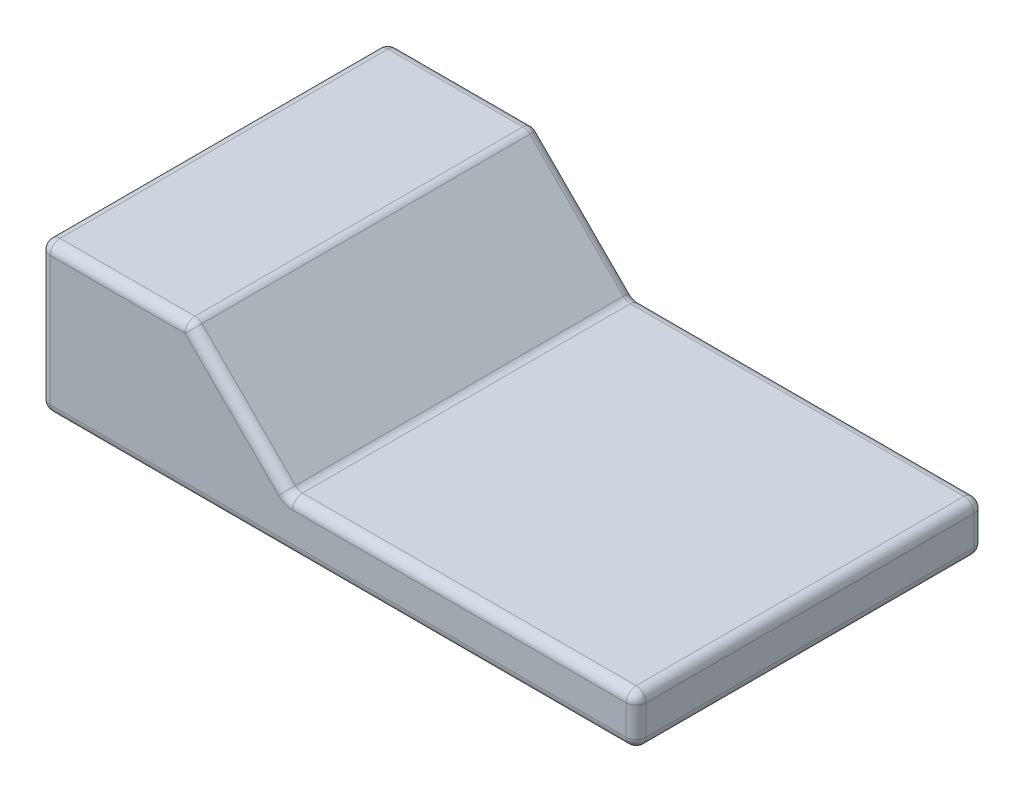
ISO-10303-21;
HEADER;
FILE_DESCRIPTION(('STEP AP214'),'2;1');
FILE_NAME('part.step','',(''),(''),'','','');
FILE_SCHEMA(('AUTOMOTIVE_DESIGN { 1 0 10303 214 1 1 1 1 }'));
ENDSEC;
DATA;
#1=APPLICATION_CONTEXT('core data for automotive mechanical design processes');
#2=APPLICATION_PROTOCOL_DEFINITION('international standard','automotive_design',2000,#1);
#3=PRODUCT_CONTEXT('',#1,'mechanical');
#4=PRODUCT('Part','Part','',(#3));
#5=PRODUCT_RELATED_PRODUCT_CATEGORY('part','',(#4));
#6=PRODUCT_DEFINITION_FORMATION('','',#4);
#7=PRODUCT_DEFINITION_CONTEXT('part definition',#1,'design');
#8=PRODUCT_DEFINITION('design','',#6,#7);
#9=PRODUCT_DEFINITION_SHAPE('','',#8);
#10=(LENGTH_UNIT() NAMED_UNIT(*) SI_UNIT(.MILLI.,.METRE.));
#11=(NAMED_UNIT(*) PLANE_ANGLE_UNIT() SI_UNIT($,.RADIAN.));
#12=(NAMED_UNIT(*) SI_UNIT($,.STERADIAN.) SOLID_ANGLE_UNIT());
#13=UNCERTAINTY_MEASURE_WITH_UNIT(LENGTH_MEASURE(1.E-05),#10,'distance_accuracy_value','');
#14=(GEOMETRIC_REPRESENTATION_CONTEXT(3) GLOBAL_UNCERTAINTY_ASSIGNED_CONTEXT((#13)) GLOBAL_UNIT_ASSIGNED_CONTEXT((#10,
#11,#12)) REPRESENTATION_CONTEXT('',''));
#15=CARTESIAN_POINT('',(0.,0.,0.));
#16=DIRECTION('',(0.,0.,1.));
#17=DIRECTION('',(1.,0.,0.));
#18=AXIS2_PLACEMENT_3D('',#15,#16,#17);
#19=CARTESIAN_POINT('',(48.7982787619449,82.5,6.));
#20=DIRECTION('',(-1.,0.,0.));
#21=DIRECTION('',(0.,0.,1.));
#22=AXIS2_PLACEMENT_3D('',#19,#20,#21);
#23=CONICAL_SURFACE('',#22,2.,1.02974425867666);
#24=CARTESIAN_POINT('',(50.,82.5,6.));
#25=VERTEX_POINT('',#24);
#26=VERTEX_LOOP('',#25);
#27=FACE_BOUND('',#26,.T.);
#28=CARTESIAN_POINT('',(48.7982787619449,82.5,6.));
#29=DIRECTION('',(-1.,0.,0.));
#30=DIRECTION('',(0.,0.,1.));
#31=AXIS2_PLACEMENT_3D('',#28,#29,#30);
#32=CIRCLE('',#31,2.);
#33=CARTESIAN_POINT('',(48.7982787619449,82.5,8.));
#34=VERTEX_POINT('',#33);
#35=EDGE_CURVE('E195',#34,#34,#32,.T.);
#36=ORIENTED_EDGE('',*,*,#35,.T.);
#37=EDGE_LOOP('',(#36));
#38=FACE_BOUND('',#37,.T.);
#39=ADVANCED_FACE('F47',(#27,#38),#23,.F.);
#40=CARTESIAN_POINT('',(32.,82.5,6.));
#41=DIRECTION('',(-1.,0.,0.));
#42=DIRECTION('',(0.,0.,1.));
#43=AXIS2_PLACEMENT_3D('',#40,#41,#42);
#44=CYLINDRICAL_SURFACE('',#43,2.);
#45=ORIENTED_EDGE('',*,*,#35,.F.);
#46=EDGE_LOOP('',(#45));
#47=FACE_BOUND('',#46,.T.);
#48=CARTESIAN_POINT('',(32.025,82.5,6.));
#49=DIRECTION('',(-1.,0.,0.));
#50=DIRECTION('',(0.,0.,1.));
#51=AXIS2_PLACEMENT_3D('',#48,#49,#50);
#52=CIRCLE('',#51,2.);
#53=CARTESIAN_POINT('',(32.025,82.5,8.));
#54=VERTEX_POINT('',#53);
#55=EDGE_CURVE('E191',#54,#54,#52,.T.);
#56=ORIENTED_EDGE('',*,*,#55,.T.);
#57=EDGE_LOOP('',(#56));
#58=FACE_BOUND('',#57,.T.);
#59=ADVANCED_FACE('F393',(#47,#58),#44,.F.);
#60=CARTESIAN_POINT('',(33.,82.5,6.));
#61=DIRECTION('',(-1.,0.,0.));
#62=DIRECTION('',(0.,0.,1.));
#63=AXIS2_PLACEMENT_3D('',#60,#61,#62);
#64=TOROIDAL_SURFACE('',#63,2.22220486043288,1.);
#65=CARTESIAN_POINT('',(32.,82.5,6.));
#66=DIRECTION('',(-1.,0.,0.));
#67=DIRECTION('',(0.,0.,1.));
#68=AXIS2_PLACEMENT_3D('',#65,#66,#67);
#69=CIRCLE('',#68,2.22220486043288);
#70=CARTESIAN_POINT('',(32.,82.5,8.22220486043287));
#71=VERTEX_POINT('',#70);
#72=EDGE_CURVE('E55',#71,#71,#69,.F.);
#73=ORIENTED_EDGE('',*,*,#72,.F.);
#74=EDGE_LOOP('',(#73));
#75=FACE_BOUND('',#74,.T.);
#76=ORIENTED_EDGE('',*,*,#55,.F.);
#77=EDGE_LOOP('',(#76));
#78=FACE_BOUND('',#77,.T.);
#79=ADVANCED_FACE('F49',(#75,#78),#64,.T.);
#80=CARTESIAN_POINT('',(32.,0.,0.));
#81=DIRECTION('',(-1.,0.,0.));
#82=DIRECTION('',(0.,0.,1.));
#83=AXIS2_PLACEMENT_3D('',#80,#81,#82);
#84=PLANE('',#83);
#85=CARTESIAN_POINT('',(32.,82.5,-6.));
#86=DIRECTION('',(-1.,0.,0.));
#87=DIRECTION('',(0.,0.,1.));
#88=AXIS2_PLACEMENT_3D('',#85,#86,#87);
#89=CIRCLE('',#88,2.22220486043288);
#90=CARTESIAN_POINT('',(32.,82.5,-3.77779513956712));
#91=VERTEX_POINT('',#90);
#92=EDGE_CURVE('E11',#91,#91,#89,.F.);
#93=ORIENTED_EDGE('',*,*,#92,.T.);
#94=EDGE_LOOP('',(#93));
#95=FACE_BOUND('',#94,.T.);
#96=ORIENTED_EDGE('',*,*,#72,.T.);
#97=EDGE_LOOP('',(#96));
#98=FACE_BOUND('',#97,.T.);
#99=DIRECTION('',(0.,0.,-1.));
#100=VECTOR('',#99,1.);
#101=CARTESIAN_POINT('',(32.,76.,17.5));
#102=LINE('',#101,#100);
#103=CARTESIAN_POINT('',(32.,76.,-16.5));
#104=VERTEX_POINT('',#103);
#105=CARTESIAN_POINT('',(32.,76.,16.5));
#106=VERTEX_POINT('',#105);
#107=EDGE_CURVE('E250',#104,#106,#102,.F.);
#108=ORIENTED_EDGE('',*,*,#107,.T.);
#109=DIRECTION('',(0.,-1.,0.));
#110=VECTOR('',#109,1.);
#111=CARTESIAN_POINT('',(32.,90.,16.5));
#112=LINE('',#111,#110);
#113=CARTESIAN_POINT('',(32.,89.,16.5));
#114=VERTEX_POINT('',#113);
#115=EDGE_CURVE('E252',#106,#114,#112,.F.);
#116=ORIENTED_EDGE('',*,*,#115,.T.);
#117=DIRECTION('',(0.,0.,1.));
#118=VECTOR('',#117,1.);
#119=CARTESIAN_POINT('',(32.,89.,-17.5));
#120=LINE('',#119,#118);
#121=CARTESIAN_POINT('',(32.,89.,-16.5));
#122=VERTEX_POINT('',#121);
#123=EDGE_CURVE('E246',#114,#122,#120,.F.);
#124=ORIENTED_EDGE('',*,*,#123,.T.);
#125=DIRECTION('',(0.,1.,0.));
#126=VECTOR('',#125,1.);
#127=CARTESIAN_POINT('',(32.,75.,-16.5));
#128=LINE('',#127,#126);
#129=EDGE_CURVE('E248',#122,#104,#128,.F.);
#130=ORIENTED_EDGE('',*,*,#129,.T.);
#131=EDGE_LOOP('',(#108,#116,#124,#130));
#132=FACE_BOUND('',#131,.T.);
#133=ADVANCED_FACE('F185',(#95,#98,#132),#84,.T.);
#134=CARTESIAN_POINT('',(48.7982787619449,82.5,-6.));
#135=DIRECTION('',(-1.,0.,0.));
#136=DIRECTION('',(0.,0.,1.));
#137=AXIS2_PLACEMENT_3D('',#134,#135,#136);
#138=CONICAL_SURFACE('',#137,2.,1.02974425867666);
#139=CARTESIAN_POINT('',(50.,82.5,-6.));
#140=VERTEX_POINT('',#139);
#141=VERTEX_LOOP('',#140);
#142=FACE_BOUND('',#141,.T.);
#143=CARTESIAN_POINT('',(48.7982787619449,82.5,-6.));
#144=DIRECTION('',(-1.,0.,0.));
#145=DIRECTION('',(0.,0.,1.));
#146=AXIS2_PLACEMENT_3D('',#143,#144,#145);
#147=CIRCLE('',#146,2.);
#148=CARTESIAN_POINT('',(48.7982787619449,82.5,-4.));
#149=VERTEX_POINT('',#148);
#150=EDGE_CURVE('E189',#149,#149,#147,.T.);
#151=ORIENTED_EDGE('',*,*,#150,.T.);
#152=EDGE_LOOP('',(#151));
#153=FACE_BOUND('',#152,.T.);
#154=ADVANCED_FACE('F181',(#142,#153),#138,.F.);
#155=CARTESIAN_POINT('',(32.,82.5,-6.));
#156=DIRECTION('',(-1.,0.,0.));
#157=DIRECTION('',(0.,0.,1.));
#158=AXIS2_PLACEMENT_3D('',#155,#156,#157);
#159=CYLINDRICAL_SURFACE('',#158,2.);
#160=ORIENTED_EDGE('',*,*,#150,.F.);
#161=EDGE_LOOP('',(#160));
#162=FACE_BOUND('',#161,.T.);
#163=CARTESIAN_POINT('',(32.025,82.5,-6.));
#164=DIRECTION('',(-1.,0.,0.));
#165=DIRECTION('',(0.,0.,1.));
#166=AXIS2_PLACEMENT_3D('',#163,#164,#165);
#167=CIRCLE('',#166,2.);
#168=CARTESIAN_POINT('',(32.025,82.5,-4.));
#169=VERTEX_POINT('',#168);
#170=EDGE_CURVE('E192',#169,#169,#167,.T.);
#171=ORIENTED_EDGE('',*,*,#170,.T.);
#172=EDGE_LOOP('',(#171));
#173=FACE_BOUND('',#172,.T.);
#174=ADVANCED_FACE('F184',(#162,#173),#159,.F.);
#175=CARTESIAN_POINT('',(33.,82.5,-6.));
#176=DIRECTION('',(-1.,0.,0.));
#177=DIRECTION('',(0.,0.,1.));
#178=AXIS2_PLACEMENT_3D('',#175,#176,#177);
#179=TOROIDAL_SURFACE('',#178,2.22220486043288,1.);
#180=ORIENTED_EDGE('',*,*,#92,.F.);
#181=EDGE_LOOP('',(#180));
#182=FACE_BOUND('',#181,.T.);
#183=ORIENTED_EDGE('',*,*,#170,.F.);
#184=EDGE_LOOP('',(#183));
#185=FACE_BOUND('',#184,.T.);
#186=ADVANCED_FACE('F431',(#182,#185),#179,.T.);
#187=CARTESIAN_POINT('',(57.,90.,17.5));
#188=DIRECTION('',(0.,0.,-1.));
#189=DIRECTION('',(-1.,0.,0.));
#190=AXIS2_PLACEMENT_3D('',#187,#188,#189);
#191=PLANE('',#190);
#192=DIRECTION('',(-1.,0.,0.));
#193=VECTOR('',#192,1.);
#194=CARTESIAN_POINT('',(57.,76.,17.5));
#195=LINE('',#194,#193);
#196=CARTESIAN_POINT('',(33.,76.,17.5));
#197=VERTEX_POINT('',#196);
#198=CARTESIAN_POINT('',(91.,76.,17.5));
#199=VERTEX_POINT('',#198);
#200=EDGE_CURVE('E236',#197,#199,#195,.F.);
#201=ORIENTED_EDGE('',*,*,#200,.T.);
#202=DIRECTION('',(0.,1.,0.));
#203=VECTOR('',#202,1.);
#204=CARTESIAN_POINT('',(91.,90.,17.5));
#205=LINE('',#204,#203);
#206=CARTESIAN_POINT('',(91.,79.,17.5));
#207=VERTEX_POINT('',#206);
#208=EDGE_CURVE('E243',#199,#207,#205,.T.);
#209=ORIENTED_EDGE('',*,*,#208,.T.);
#210=DIRECTION('',(-1.,0.,0.));
#211=VECTOR('',#210,1.);
#212=CARTESIAN_POINT('',(57.,79.,17.5));
#213=LINE('',#212,#211);
#214=CARTESIAN_POINT('',(57.4142135623731,79.,17.5));
#215=VERTEX_POINT('',#214);
#216=EDGE_CURVE('E241',#207,#215,#213,.T.);
#217=ORIENTED_EDGE('',*,*,#216,.T.);
#218=CARTESIAN_POINT('',(57.4142135623731,81.,17.5));
#219=DIRECTION('',(0.,0.,-1.));
#220=DIRECTION('',(-1.,0.,0.));
#221=AXIS2_PLACEMENT_3D('',#218,#219,#220);
#222=CIRCLE('',#221,2.);
#223=CARTESIAN_POINT('',(56.,79.5857864376269,17.5));
#224=VERTEX_POINT('',#223);
#225=EDGE_CURVE('E238',#224,#215,#222,.F.);
#226=ORIENTED_EDGE('',*,*,#225,.F.);
#227=DIRECTION('',(0.70710678118655,-0.707106781186545,0.));
#228=VECTOR('',#227,1.);
#229=CARTESIAN_POINT('',(46.2928932188134,89.2928932188134,17.5));
#230=LINE('',#229,#228);
#231=CARTESIAN_POINT('',(46.5857864376269,89.,17.5));
#232=VERTEX_POINT('',#231);
#233=EDGE_CURVE('E232',#224,#232,#230,.F.);
#234=ORIENTED_EDGE('',*,*,#233,.T.);
#235=DIRECTION('',(-1.,0.,0.));
#236=VECTOR('',#235,1.);
#237=CARTESIAN_POINT('',(57.,89.,17.5));
#238=LINE('',#237,#236);
#239=CARTESIAN_POINT('',(33.,89.,17.5));
#240=VERTEX_POINT('',#239);
#241=EDGE_CURVE('E230',#232,#240,#238,.T.);
#242=ORIENTED_EDGE('',*,*,#241,.T.);
#243=DIRECTION('',(0.,-1.,0.));
#244=VECTOR('',#243,1.);
#245=CARTESIAN_POINT('',(33.,75.,17.5));
#246=LINE('',#245,#244);
#247=EDGE_CURVE('E234',#240,#197,#246,.T.);
#248=ORIENTED_EDGE('',*,*,#247,.T.);
#249=EDGE_LOOP('',(#201,#209,#217,#226,#234,#242,#248));
#250=FACE_BOUND('',#249,.T.);
#251=ADVANCED_FACE('F427',(#250),#191,.F.);
#252=CARTESIAN_POINT('',(57.,75.,-17.5));
#253=DIRECTION('',(0.,1.,0.));
#254=DIRECTION('',(0.,0.,1.));
#255=AXIS2_PLACEMENT_3D('',#252,#253,#254);
#256=PLANE('',#255);
#257=DIRECTION('',(0.,0.,1.));
#258=VECTOR('',#257,1.);
#259=CARTESIAN_POINT('',(91.,75.,-17.5));
#260=LINE('',#259,#258);
#261=CARTESIAN_POINT('',(91.,75.,-16.5));
#262=VERTEX_POINT('',#261);
#263=CARTESIAN_POINT('',(91.,75.,16.5));
#264=VERTEX_POINT('',#263);
#265=EDGE_CURVE('E259',#262,#264,#260,.T.);
#266=ORIENTED_EDGE('',*,*,#265,.T.);
#267=DIRECTION('',(-1.,0.,0.));
#268=VECTOR('',#267,1.);
#269=CARTESIAN_POINT('',(57.,75.,16.5));
#270=LINE('',#269,#268);
#271=CARTESIAN_POINT('',(33.,75.,16.5));
#272=VERTEX_POINT('',#271);
#273=EDGE_CURVE('E261',#264,#272,#270,.T.);
#274=ORIENTED_EDGE('',*,*,#273,.T.);
#275=DIRECTION('',(0.,0.,-1.));
#276=VECTOR('',#275,1.);
#277=CARTESIAN_POINT('',(33.,75.,-17.5));
#278=LINE('',#277,#276);
#279=CARTESIAN_POINT('',(33.,75.,-16.5));
#280=VERTEX_POINT('',#279);
#281=EDGE_CURVE('E257',#272,#280,#278,.T.);
#282=ORIENTED_EDGE('',*,*,#281,.T.);
#283=DIRECTION('',(-1.,0.,0.));
#284=VECTOR('',#283,1.);
#285=CARTESIAN_POINT('',(57.,75.,-16.5));
#286=LINE('',#285,#284);
#287=EDGE_CURVE('E255',#280,#262,#286,.F.);
#288=ORIENTED_EDGE('',*,*,#287,.T.);
#289=EDGE_LOOP('',(#266,#274,#282,#288));
#290=FACE_BOUND('',#289,.T.);
#291=ADVANCED_FACE('F423',(#290),#256,.F.);
#292=CARTESIAN_POINT('',(57.,90.,-17.5));
#293=DIRECTION('',(0.,0.,1.));
#294=DIRECTION('',(0.,-1.,0.));
#295=AXIS2_PLACEMENT_3D('',#292,#293,#294);
#296=PLANE('',#295);
#297=DIRECTION('',(0.,-1.,0.));
#298=VECTOR('',#297,1.);
#299=CARTESIAN_POINT('',(91.,90.,-17.5));
#300=LINE('',#299,#298);
#301=CARTESIAN_POINT('',(91.,79.,-17.5));
#302=VERTEX_POINT('',#301);
#303=CARTESIAN_POINT('',(91.,76.,-17.5));
#304=VERTEX_POINT('',#303);
#305=EDGE_CURVE('E276',#302,#304,#300,.T.);
#306=ORIENTED_EDGE('',*,*,#305,.T.);
#307=DIRECTION('',(-1.,0.,0.));
#308=VECTOR('',#307,1.);
#309=CARTESIAN_POINT('',(57.,76.,-17.5));
#310=LINE('',#309,#308);
#311=CARTESIAN_POINT('',(33.,76.,-17.5));
#312=VERTEX_POINT('',#311);
#313=EDGE_CURVE('E278',#304,#312,#310,.T.);
#314=ORIENTED_EDGE('',*,*,#313,.T.);
#315=DIRECTION('',(0.,1.,0.));
#316=VECTOR('',#315,1.);
#317=CARTESIAN_POINT('',(33.,90.,-17.5));
#318=LINE('',#317,#316);
#319=CARTESIAN_POINT('',(33.,89.,-17.5));
#320=VERTEX_POINT('',#319);
#321=EDGE_CURVE('E268',#312,#320,#318,.T.);
#322=ORIENTED_EDGE('',*,*,#321,.T.);
#323=DIRECTION('',(-1.,0.,0.));
#324=VECTOR('',#323,1.);
#325=CARTESIAN_POINT('',(57.,89.,-17.5));
#326=LINE('',#325,#324);
#327=CARTESIAN_POINT('',(46.5857864376269,89.,-17.5));
#328=VERTEX_POINT('',#327);
#329=EDGE_CURVE('E264',#320,#328,#326,.F.);
#330=ORIENTED_EDGE('',*,*,#329,.T.);
#331=DIRECTION('',(-0.70710678118655,0.707106781186545,0.));
#332=VECTOR('',#331,1.);
#333=CARTESIAN_POINT('',(56.2928932188135,79.2928932188135,-17.5));
#334=LINE('',#333,#332);
#335=CARTESIAN_POINT('',(56.,79.5857864376269,-17.5));
#336=VERTEX_POINT('',#335);
#337=EDGE_CURVE('E266',#328,#336,#334,.F.);
#338=ORIENTED_EDGE('',*,*,#337,.T.);
#339=CARTESIAN_POINT('',(57.4142135623731,81.,-17.5));
#340=DIRECTION('',(0.,0.,1.));
#341=DIRECTION('',(0.,-1.,0.));
#342=AXIS2_PLACEMENT_3D('',#339,#340,#341);
#343=CIRCLE('',#342,2.);
#344=CARTESIAN_POINT('',(57.4142135623731,79.,-17.5));
#345=VERTEX_POINT('',#344);
#346=EDGE_CURVE('E271',#345,#336,#343,.F.);
#347=ORIENTED_EDGE('',*,*,#346,.F.);
#348=DIRECTION('',(-1.,0.,0.));
#349=VECTOR('',#348,1.);
#350=CARTESIAN_POINT('',(92.,79.,-17.5));
#351=LINE('',#350,#349);
#352=EDGE_CURVE('E274',#345,#302,#351,.F.);
#353=ORIENTED_EDGE('',*,*,#352,.T.);
#354=EDGE_LOOP('',(#306,#314,#322,#330,#338,#347,#353));
#355=FACE_BOUND('',#354,.T.);
#356=ADVANCED_FACE('F420',(#355),#296,.F.);
#357=CARTESIAN_POINT('',(57.,90.,-17.5));
#358=DIRECTION('',(0.,-1.,0.));
#359=DIRECTION('',(0.,0.,-1.));
#360=AXIS2_PLACEMENT_3D('',#357,#358,#359);
#361=PLANE('',#360);
#362=DIRECTION('',(-1.,0.,0.));
#363=VECTOR('',#362,1.);
#364=CARTESIAN_POINT('',(57.,90.,-16.5));
#365=LINE('',#364,#363);
#366=CARTESIAN_POINT('',(46.5857864376269,90.,-16.5));
#367=VERTEX_POINT('',#366);
#368=CARTESIAN_POINT('',(33.,90.,-16.5));
#369=VERTEX_POINT('',#368);
#370=EDGE_CURVE('E62',#367,#369,#365,.T.);
#371=ORIENTED_EDGE('',*,*,#370,.T.);
#372=DIRECTION('',(0.,0.,1.));
#373=VECTOR('',#372,1.);
#374=CARTESIAN_POINT('',(33.,90.,17.5));
#375=LINE('',#374,#373);
#376=CARTESIAN_POINT('',(33.,90.,16.5));
#377=VERTEX_POINT('',#376);
#378=EDGE_CURVE('E284',#369,#377,#375,.T.);
#379=ORIENTED_EDGE('',*,*,#378,.T.);
#380=DIRECTION('',(-1.,0.,0.));
#381=VECTOR('',#380,1.);
#382=CARTESIAN_POINT('',(57.,90.,16.5));
#383=LINE('',#382,#381);
#384=CARTESIAN_POINT('',(46.5857864376269,90.,16.5));
#385=VERTEX_POINT('',#384);
#386=EDGE_CURVE('E280',#377,#385,#383,.F.);
#387=ORIENTED_EDGE('',*,*,#386,.T.);
#388=DIRECTION('',(0.,0.,1.));
#389=VECTOR('',#388,1.);
#390=CARTESIAN_POINT('',(46.5857864376269,90.,-17.5));
#391=LINE('',#390,#389);
#392=EDGE_CURVE('E67',#385,#367,#391,.F.);
#393=ORIENTED_EDGE('',*,*,#392,.T.);
#394=EDGE_LOOP('',(#371,#379,#387,#393));
#395=FACE_BOUND('',#394,.T.);
#396=ADVANCED_FACE('F417',(#395),#361,.F.);
#397=CARTESIAN_POINT('',(92.,80.,-17.5));
#398=DIRECTION('',(0.,1.,0.));
#399=DIRECTION('',(0.,0.,1.));
#400=AXIS2_PLACEMENT_3D('',#397,#398,#399);
#401=PLANE('',#400);
#402=DIRECTION('',(0.,0.,1.));
#403=VECTOR('',#402,1.);
#404=CARTESIAN_POINT('',(57.4142135623731,80.,17.5));
#405=LINE('',#404,#403);
#406=CARTESIAN_POINT('',(57.4142135623731,80.,-16.5));
#407=VERTEX_POINT('',#406);
#408=CARTESIAN_POINT('',(57.4142135623731,80.,16.5));
#409=VERTEX_POINT('',#408);
#410=EDGE_CURVE('E205',#407,#409,#405,.T.);
#411=ORIENTED_EDGE('',*,*,#410,.T.);
#412=DIRECTION('',(-1.,0.,0.));
#413=VECTOR('',#412,1.);
#414=CARTESIAN_POINT('',(92.,80.,16.5));
#415=LINE('',#414,#413);
#416=CARTESIAN_POINT('',(91.,80.,16.5));
#417=VERTEX_POINT('',#416);
#418=EDGE_CURVE('E210',#409,#417,#415,.F.);
#419=ORIENTED_EDGE('',*,*,#418,.T.);
#420=DIRECTION('',(0.,0.,-1.));
#421=VECTOR('',#420,1.);
#422=CARTESIAN_POINT('',(91.,80.,-17.5));
#423=LINE('',#422,#421);
#424=CARTESIAN_POINT('',(91.,80.,-16.5));
#425=VERTEX_POINT('',#424);
#426=EDGE_CURVE('E207',#417,#425,#423,.T.);
#427=ORIENTED_EDGE('',*,*,#426,.T.);
#428=DIRECTION('',(-1.,0.,0.));
#429=VECTOR('',#428,1.);
#430=CARTESIAN_POINT('',(57.,80.,-16.5));
#431=LINE('',#430,#429);
#432=EDGE_CURVE('E203',#425,#407,#431,.T.);
#433=ORIENTED_EDGE('',*,*,#432,.T.);
#434=EDGE_LOOP('',(#411,#419,#427,#433));
#435=FACE_BOUND('',#434,.T.);
#436=ADVANCED_FACE('F415',(#435),#401,.T.);
#437=CARTESIAN_POINT('',(92.,0.,0.));
#438=DIRECTION('',(-1.,0.,0.));
#439=DIRECTION('',(0.,0.,1.));
#440=AXIS2_PLACEMENT_3D('',#437,#438,#439);
#441=PLANE('',#440);
#442=DIRECTION('',(0.,-1.,0.));
#443=VECTOR('',#442,1.);
#444=CARTESIAN_POINT('',(92.,0.,-16.5));
#445=LINE('',#444,#443);
#446=CARTESIAN_POINT('',(92.,76.,-16.5));
#447=VERTEX_POINT('',#446);
#448=CARTESIAN_POINT('',(92.,79.,-16.5));
#449=VERTEX_POINT('',#448);
#450=EDGE_CURVE('E212',#447,#449,#445,.F.);
#451=ORIENTED_EDGE('',*,*,#450,.T.);
#452=DIRECTION('',(0.,0.,-1.));
#453=VECTOR('',#452,1.);
#454=CARTESIAN_POINT('',(92.,79.,17.5));
#455=LINE('',#454,#453);
#456=CARTESIAN_POINT('',(92.,79.,16.5));
#457=VERTEX_POINT('',#456);
#458=EDGE_CURVE('E218',#449,#457,#455,.F.);
#459=ORIENTED_EDGE('',*,*,#458,.T.);
#460=DIRECTION('',(0.,1.,0.));
#461=VECTOR('',#460,1.);
#462=CARTESIAN_POINT('',(92.,0.,16.5));
#463=LINE('',#462,#461);
#464=CARTESIAN_POINT('',(92.,76.,16.5));
#465=VERTEX_POINT('',#464);
#466=EDGE_CURVE('E216',#457,#465,#463,.F.);
#467=ORIENTED_EDGE('',*,*,#466,.T.);
#468=DIRECTION('',(0.,0.,1.));
#469=VECTOR('',#468,1.);
#470=CARTESIAN_POINT('',(92.,76.,0.));
#471=LINE('',#470,#469);
#472=EDGE_CURVE('E214',#465,#447,#471,.F.);
#473=ORIENTED_EDGE('',*,*,#472,.T.);
#474=EDGE_LOOP('',(#451,#459,#467,#473));
#475=FACE_BOUND('',#474,.T.);
#476=ADVANCED_FACE('F440',(#475),#441,.F.);
#477=CARTESIAN_POINT('',(57.,80.,0.));
#478=DIRECTION('',(-0.707106781186545,-0.70710678118655,0.));
#479=DIRECTION('',(0.,0.,1.));
#480=AXIS2_PLACEMENT_3D('',#477,#478,#479);
#481=PLANE('',#480);
#482=DIRECTION('',(-0.70710678118655,0.707106781186545,0.));
#483=VECTOR('',#482,1.);
#484=CARTESIAN_POINT('',(57.,80.,16.5));
#485=LINE('',#484,#483);
#486=CARTESIAN_POINT('',(47.2928932188134,89.7071067811865,16.5));
#487=VERTEX_POINT('',#486);
#488=CARTESIAN_POINT('',(56.7071067811866,80.2928932188135,16.5));
#489=VERTEX_POINT('',#488);
#490=EDGE_CURVE('E225',#487,#489,#485,.F.);
#491=ORIENTED_EDGE('',*,*,#490,.T.);
#492=DIRECTION('',(0.,0.,-1.));
#493=VECTOR('',#492,1.);
#494=CARTESIAN_POINT('',(56.7071067811866,80.2928932188135,-17.5));
#495=LINE('',#494,#493);
#496=CARTESIAN_POINT('',(56.7071067811866,80.2928932188135,-16.5));
#497=VERTEX_POINT('',#496);
#498=EDGE_CURVE('E227',#489,#497,#495,.T.);
#499=ORIENTED_EDGE('',*,*,#498,.T.);
#500=DIRECTION('',(0.70710678118655,-0.707106781186545,0.));
#501=VECTOR('',#500,1.);
#502=CARTESIAN_POINT('',(47.,90.,-16.5));
#503=LINE('',#502,#501);
#504=CARTESIAN_POINT('',(47.2928932188134,89.7071067811865,-16.5));
#505=VERTEX_POINT('',#504);
#506=EDGE_CURVE('E223',#497,#505,#503,.F.);
#507=ORIENTED_EDGE('',*,*,#506,.T.);
#508=DIRECTION('',(0.,0.,-1.));
#509=VECTOR('',#508,1.);
#510=CARTESIAN_POINT('',(47.2928932188134,89.7071067811865,17.5));
#511=LINE('',#510,#509);
#512=EDGE_CURVE('E221',#505,#487,#511,.F.);
#513=ORIENTED_EDGE('',*,*,#512,.T.);
#514=EDGE_LOOP('',(#491,#499,#507,#513));
#515=FACE_BOUND('',#514,.T.);
#516=ADVANCED_FACE('F434',(#515),#481,.F.);
#517=CARTESIAN_POINT('',(33.,89.,-17.5));
#518=DIRECTION('',(0.,0.,-1.));
#519=DIRECTION('',(-1.,0.,0.));
#520=AXIS2_PLACEMENT_3D('',#517,#518,#519);
#521=CYLINDRICAL_SURFACE('',#520,1.);
#522=CARTESIAN_POINT('',(33.,89.,16.5));
#523=DIRECTION('',(0.,0.,1.));
#524=DIRECTION('',(1.,0.,0.));
#525=AXIS2_PLACEMENT_3D('',#522,#523,#524);
#526=CIRCLE('',#525,1.);
#527=EDGE_CURVE('E198',#377,#114,#526,.T.);
#528=ORIENTED_EDGE('',*,*,#527,.F.);
#529=ORIENTED_EDGE('',*,*,#378,.F.);
#530=CARTESIAN_POINT('',(33.,89.,-16.5));
#531=DIRECTION('',(0.,0.,-1.));
#532=DIRECTION('',(-1.,0.,0.));
#533=AXIS2_PLACEMENT_3D('',#530,#531,#532);
#534=CIRCLE('',#533,1.);
#535=EDGE_CURVE('E382',#122,#369,#534,.T.);
#536=ORIENTED_EDGE('',*,*,#535,.F.);
#537=ORIENTED_EDGE('',*,*,#123,.F.);
#538=EDGE_LOOP('',(#528,#529,#536,#537));
#539=FACE_BOUND('',#538,.T.);
#540=ADVANCED_FACE('F439',(#539),#521,.T.);
#541=CARTESIAN_POINT('',(33.,89.,16.5));
#542=DIRECTION('',(-1.,0.,0.));
#543=DIRECTION('',(0.,0.,1.));
#544=AXIS2_PLACEMENT_3D('',#541,#542,#543);
#545=SPHERICAL_SURFACE('',#544,1.);
#546=CARTESIAN_POINT('',(33.,89.,16.5));
#547=DIRECTION('',(-1.,0.,0.));
#548=DIRECTION('',(0.,0.,1.));
#549=AXIS2_PLACEMENT_3D('',#546,#547,#548);
#550=CIRCLE('',#549,1.);
#551=EDGE_CURVE('E377',#377,#240,#550,.F.);
#552=ORIENTED_EDGE('',*,*,#551,.F.);
#553=ORIENTED_EDGE('',*,*,#527,.T.);
#554=CARTESIAN_POINT('',(33.,89.,16.5));
#555=DIRECTION('',(0.,1.,0.));
#556=DIRECTION('',(0.,0.,1.));
#557=AXIS2_PLACEMENT_3D('',#554,#555,#556);
#558=CIRCLE('',#557,1.);
#559=EDGE_CURVE('E380',#240,#114,#558,.F.);
#560=ORIENTED_EDGE('',*,*,#559,.F.);
#561=EDGE_LOOP('',(#552,#553,#560));
#562=FACE_BOUND('',#561,.T.);
#563=ADVANCED_FACE('F553',(#562),#545,.T.);
#564=CARTESIAN_POINT('',(33.,89.,-16.5));
#565=DIRECTION('',(0.,1.,0.));
#566=DIRECTION('',(0.,0.,1.));
#567=AXIS2_PLACEMENT_3D('',#564,#565,#566);
#568=SPHERICAL_SURFACE('',#567,1.);
#569=CARTESIAN_POINT('',(33.,89.,-16.5));
#570=DIRECTION('',(0.,1.,0.));
#571=DIRECTION('',(0.,0.,1.));
#572=AXIS2_PLACEMENT_3D('',#569,#570,#571);
#573=CIRCLE('',#572,1.);
#574=EDGE_CURVE('E371',#122,#320,#573,.F.);
#575=ORIENTED_EDGE('',*,*,#574,.F.);
#576=ORIENTED_EDGE('',*,*,#535,.T.);
#577=CARTESIAN_POINT('',(33.,89.,-16.5));
#578=DIRECTION('',(-1.,0.,0.));
#579=DIRECTION('',(0.,0.,1.));
#580=AXIS2_PLACEMENT_3D('',#577,#578,#579);
#581=CIRCLE('',#580,1.);
#582=EDGE_CURVE('E374',#320,#369,#581,.F.);
#583=ORIENTED_EDGE('',*,*,#582,.F.);
#584=EDGE_LOOP('',(#575,#576,#583));
#585=FACE_BOUND('',#584,.T.);
#586=ADVANCED_FACE('F549',(#585),#568,.T.);
#587=CARTESIAN_POINT('',(33.,90.,16.5));
#588=DIRECTION('',(0.,1.,0.));
#589=DIRECTION('',(0.,0.,1.));
#590=AXIS2_PLACEMENT_3D('',#587,#588,#589);
#591=CYLINDRICAL_SURFACE('',#590,1.);
#592=ORIENTED_EDGE('',*,*,#559,.T.);
#593=ORIENTED_EDGE('',*,*,#115,.F.);
#594=CARTESIAN_POINT('',(33.,76.,16.5));
#595=DIRECTION('',(0.,-1.,0.));
#596=DIRECTION('',(0.,0.,-1.));
#597=AXIS2_PLACEMENT_3D('',#594,#595,#596);
#598=CIRCLE('',#597,1.);
#599=EDGE_CURVE('E365',#197,#106,#598,.T.);
#600=ORIENTED_EDGE('',*,*,#599,.F.);
#601=ORIENTED_EDGE('',*,*,#247,.F.);
#602=EDGE_LOOP('',(#592,#593,#600,#601));
#603=FACE_BOUND('',#602,.T.);
#604=ADVANCED_FACE('F545',(#603),#591,.T.);
#605=CARTESIAN_POINT('',(57.,89.,16.5));
#606=DIRECTION('',(-1.,0.,0.));
#607=DIRECTION('',(0.,0.,1.));
#608=AXIS2_PLACEMENT_3D('',#605,#606,#607);
#609=CYLINDRICAL_SURFACE('',#608,1.);
#610=ORIENTED_EDGE('',*,*,#551,.T.);
#611=ORIENTED_EDGE('',*,*,#241,.F.);
#612=CARTESIAN_POINT('',(46.5857864376269,89.,16.5));
#613=DIRECTION('',(1.,0.,0.));
#614=DIRECTION('',(0.,0.,-1.));
#615=AXIS2_PLACEMENT_3D('',#612,#613,#614);
#616=CIRCLE('',#615,1.);
#617=EDGE_CURVE('E362',#385,#232,#616,.T.);
#618=ORIENTED_EDGE('',*,*,#617,.F.);
#619=ORIENTED_EDGE('',*,*,#386,.F.);
#620=EDGE_LOOP('',(#610,#611,#618,#619));
#621=FACE_BOUND('',#620,.T.);
#622=ADVANCED_FACE('F541',(#621),#609,.T.);
#623=CARTESIAN_POINT('',(46.5857864376269,89.,-17.5));
#624=DIRECTION('',(0.,0.,-1.));
#625=DIRECTION('',(-1.,0.,0.));
#626=AXIS2_PLACEMENT_3D('',#623,#624,#625);
#627=CYLINDRICAL_SURFACE('',#626,1.);
#628=CARTESIAN_POINT('',(46.5857864376269,89.,-16.5));
#629=DIRECTION('',(0.,0.,-1.));
#630=DIRECTION('',(-1.,0.,0.));
#631=AXIS2_PLACEMENT_3D('',#628,#629,#630);
#632=CIRCLE('',#631,1.);
#633=EDGE_CURVE('E356',#367,#505,#632,.T.);
#634=ORIENTED_EDGE('',*,*,#633,.F.);
#635=ORIENTED_EDGE('',*,*,#392,.F.);
#636=CARTESIAN_POINT('',(46.5857864376269,89.,16.5));
#637=DIRECTION('',(0.,0.,1.));
#638=DIRECTION('',(1.,0.,0.));
#639=AXIS2_PLACEMENT_3D('',#636,#637,#638);
#640=CIRCLE('',#639,1.);
#641=EDGE_CURVE('E359',#487,#385,#640,.T.);
#642=ORIENTED_EDGE('',*,*,#641,.F.);
#643=ORIENTED_EDGE('',*,*,#512,.F.);
#644=EDGE_LOOP('',(#634,#635,#642,#643));
#645=FACE_BOUND('',#644,.T.);
#646=ADVANCED_FACE('F537',(#645),#627,.T.);
#647=CARTESIAN_POINT('',(57.,89.,-16.5));
#648=DIRECTION('',(-1.,0.,0.));
#649=DIRECTION('',(0.,0.,1.));
#650=AXIS2_PLACEMENT_3D('',#647,#648,#649);
#651=CYLINDRICAL_SURFACE('',#650,1.);
#652=ORIENTED_EDGE('',*,*,#582,.T.);
#653=ORIENTED_EDGE('',*,*,#370,.F.);
#654=CARTESIAN_POINT('',(46.5857864376269,89.,-16.5));
#655=DIRECTION('',(1.,0.,0.));
#656=DIRECTION('',(0.,1.,0.));
#657=AXIS2_PLACEMENT_3D('',#654,#655,#656);
#658=CIRCLE('',#657,1.);
#659=EDGE_CURVE('E353',#328,#367,#658,.T.);
#660=ORIENTED_EDGE('',*,*,#659,.F.);
#661=ORIENTED_EDGE('',*,*,#329,.F.);
#662=EDGE_LOOP('',(#652,#653,#660,#661));
#663=FACE_BOUND('',#662,.T.);
#664=ADVANCED_FACE('F533',(#663),#651,.T.);
#665=CARTESIAN_POINT('',(33.,90.,-16.5));
#666=DIRECTION('',(0.,-1.,0.));
#667=DIRECTION('',(0.,0.,-1.));
#668=AXIS2_PLACEMENT_3D('',#665,#666,#667);
#669=CYLINDRICAL_SURFACE('',#668,1.);
#670=ORIENTED_EDGE('',*,*,#574,.T.);
#671=ORIENTED_EDGE('',*,*,#321,.F.);
#672=CARTESIAN_POINT('',(33.,76.,-16.5));
#673=DIRECTION('',(0.,-1.,0.));
#674=DIRECTION('',(0.,0.,-1.));
#675=AXIS2_PLACEMENT_3D('',#672,#673,#674);
#676=CIRCLE('',#675,1.);
#677=EDGE_CURVE('E350',#104,#312,#676,.T.);
#678=ORIENTED_EDGE('',*,*,#677,.F.);
#679=ORIENTED_EDGE('',*,*,#129,.F.);
#680=EDGE_LOOP('',(#670,#671,#678,#679));
#681=FACE_BOUND('',#680,.T.);
#682=ADVANCED_FACE('F529',(#681),#669,.T.);
#683=CARTESIAN_POINT('',(33.,76.,-17.5));
#684=DIRECTION('',(0.,0.,1.));
#685=DIRECTION('',(1.,0.,0.));
#686=AXIS2_PLACEMENT_3D('',#683,#684,#685);
#687=CYLINDRICAL_SURFACE('',#686,1.);
#688=CARTESIAN_POINT('',(33.,76.,16.5));
#689=DIRECTION('',(0.,0.,1.));
#690=DIRECTION('',(0.,-1.,0.));
#691=AXIS2_PLACEMENT_3D('',#688,#689,#690);
#692=CIRCLE('',#691,1.);
#693=EDGE_CURVE('E368',#106,#272,#692,.T.);
#694=ORIENTED_EDGE('',*,*,#693,.F.);
#695=ORIENTED_EDGE('',*,*,#107,.F.);
#696=CARTESIAN_POINT('',(33.,76.,-16.5));
#697=DIRECTION('',(0.,0.,-1.));
#698=DIRECTION('',(-1.,0.,0.));
#699=AXIS2_PLACEMENT_3D('',#696,#697,#698);
#700=CIRCLE('',#699,1.);
#701=EDGE_CURVE('E347',#280,#104,#700,.T.);
#702=ORIENTED_EDGE('',*,*,#701,.F.);
#703=ORIENTED_EDGE('',*,*,#281,.F.);
#704=EDGE_LOOP('',(#694,#695,#702,#703));
#705=FACE_BOUND('',#704,.T.);
#706=ADVANCED_FACE('F525',(#705),#687,.T.);
#707=CARTESIAN_POINT('',(33.,76.,16.5));
#708=DIRECTION('',(-1.,0.,0.));
#709=DIRECTION('',(0.,0.,1.));
#710=AXIS2_PLACEMENT_3D('',#707,#708,#709);
#711=SPHERICAL_SURFACE('',#710,1.);
#712=ORIENTED_EDGE('',*,*,#599,.T.);
#713=ORIENTED_EDGE('',*,*,#693,.T.);
#714=CARTESIAN_POINT('',(33.,76.,16.5));
#715=DIRECTION('',(-1.,0.,0.));
#716=DIRECTION('',(0.,0.,1.));
#717=AXIS2_PLACEMENT_3D('',#714,#715,#716);
#718=CIRCLE('',#717,1.);
#719=EDGE_CURVE('E345',#197,#272,#718,.F.);
#720=ORIENTED_EDGE('',*,*,#719,.F.);
#721=EDGE_LOOP('',(#712,#713,#720));
#722=FACE_BOUND('',#721,.T.);
#723=ADVANCED_FACE('F521',(#722),#711,.T.);
#724=CARTESIAN_POINT('',(46.5857864376269,89.,16.5));
#725=DIRECTION('',(0.,0.,1.));
#726=DIRECTION('',(1.,0.,0.));
#727=AXIS2_PLACEMENT_3D('',#724,#725,#726);
#728=SPHERICAL_SURFACE('',#727,1.);
#729=ORIENTED_EDGE('',*,*,#641,.T.);
#730=ORIENTED_EDGE('',*,*,#617,.T.);
#731=CARTESIAN_POINT('',(46.5857864376269,89.,16.5));
#732=DIRECTION('',(-0.707106781186551,0.707106781186544,0.));
#733=DIRECTION('',(-0.707106781186544,-0.707106781186551,0.));
#734=AXIS2_PLACEMENT_3D('',#731,#732,#733);
#735=CIRCLE('',#734,1.);
#736=EDGE_CURVE('E342',#487,#232,#735,.F.);
#737=ORIENTED_EDGE('',*,*,#736,.F.);
#738=EDGE_LOOP('',(#729,#730,#737));
#739=FACE_BOUND('',#738,.T.);
#740=ADVANCED_FACE('F517',(#739),#728,.T.);
#741=CARTESIAN_POINT('',(46.5857864376269,89.,-16.5));
#742=DIRECTION('',(0.,0.,-1.));
#743=DIRECTION('',(-1.,0.,0.));
#744=AXIS2_PLACEMENT_3D('',#741,#742,#743);
#745=SPHERICAL_SURFACE('',#744,1.);
#746=ORIENTED_EDGE('',*,*,#659,.T.);
#747=ORIENTED_EDGE('',*,*,#633,.T.);
#748=CARTESIAN_POINT('',(46.5857864376269,89.,-16.5));
#749=DIRECTION('',(-0.707106781186547,0.707106781186547,0.));
#750=DIRECTION('',(-0.707106781186548,-0.707106781186548,0.));
#751=AXIS2_PLACEMENT_3D('',#748,#749,#750);
#752=CIRCLE('',#751,1.);
#753=EDGE_CURVE('E339',#328,#505,#752,.F.);
#754=ORIENTED_EDGE('',*,*,#753,.F.);
#755=EDGE_LOOP('',(#746,#747,#754));
#756=FACE_BOUND('',#755,.T.);
#757=ADVANCED_FACE('F513',(#756),#745,.T.);
#758=CARTESIAN_POINT('',(33.,76.,-16.5));
#759=DIRECTION('',(-1.,0.,0.));
#760=DIRECTION('',(0.,0.,1.));
#761=AXIS2_PLACEMENT_3D('',#758,#759,#760);
#762=SPHERICAL_SURFACE('',#761,1.);
#763=ORIENTED_EDGE('',*,*,#701,.T.);
#764=ORIENTED_EDGE('',*,*,#677,.T.);
#765=CARTESIAN_POINT('',(33.,76.,-16.5));
#766=DIRECTION('',(-1.,0.,0.));
#767=DIRECTION('',(0.,0.,1.));
#768=AXIS2_PLACEMENT_3D('',#765,#766,#767);
#769=CIRCLE('',#768,1.);
#770=EDGE_CURVE('E336',#280,#312,#769,.F.);
#771=ORIENTED_EDGE('',*,*,#770,.F.);
#772=EDGE_LOOP('',(#763,#764,#771));
#773=FACE_BOUND('',#772,.T.);
#774=ADVANCED_FACE('F509',(#773),#762,.T.);
#775=CARTESIAN_POINT('',(57.,76.,16.5));
#776=DIRECTION('',(-1.,0.,0.));
#777=DIRECTION('',(0.,0.,1.));
#778=AXIS2_PLACEMENT_3D('',#775,#776,#777);
#779=CYLINDRICAL_SURFACE('',#778,1.);
#780=ORIENTED_EDGE('',*,*,#719,.T.);
#781=ORIENTED_EDGE('',*,*,#273,.F.);
#782=CARTESIAN_POINT('',(91.,76.,16.5));
#783=DIRECTION('',(1.,0.,0.));
#784=DIRECTION('',(0.,0.,-1.));
#785=AXIS2_PLACEMENT_3D('',#782,#783,#784);
#786=CIRCLE('',#785,1.);
#787=EDGE_CURVE('E330',#199,#264,#786,.T.);
#788=ORIENTED_EDGE('',*,*,#787,.F.);
#789=ORIENTED_EDGE('',*,*,#200,.F.);
#790=EDGE_LOOP('',(#780,#781,#788,#789));
#791=FACE_BOUND('',#790,.T.);
#792=ADVANCED_FACE('F505',(#791),#779,.T.);
#793=CARTESIAN_POINT('',(51.2928932188135,84.2928932188134,16.5));
#794=DIRECTION('',(-0.70710678118655,0.707106781186545,0.));
#795=DIRECTION('',(-0.707106781186545,-0.70710678118655,0.));
#796=AXIS2_PLACEMENT_3D('',#793,#794,#795);
#797=CYLINDRICAL_SURFACE('',#796,1.);
#798=ORIENTED_EDGE('',*,*,#736,.T.);
#799=ORIENTED_EDGE('',*,*,#233,.F.);
#800=CARTESIAN_POINT('',(56.,79.5857864376269,16.5));
#801=DIRECTION('',(0.707106781186547,-0.707106781186547,0.));
#802=DIRECTION('',(0.707106781186548,0.707106781186548,0.));
#803=AXIS2_PLACEMENT_3D('',#800,#801,#802);
#804=CIRCLE('',#803,1.);
#805=EDGE_CURVE('E327',#489,#224,#804,.T.);
#806=ORIENTED_EDGE('',*,*,#805,.F.);
#807=ORIENTED_EDGE('',*,*,#490,.F.);
#808=EDGE_LOOP('',(#798,#799,#806,#807));
#809=FACE_BOUND('',#808,.T.);
#810=ADVANCED_FACE('F501',(#809),#797,.T.);
#811=CARTESIAN_POINT('',(57.4142135623731,81.,0.));
#812=DIRECTION('',(0.,0.,-1.));
#813=DIRECTION('',(-1.,0.,0.));
#814=AXIS2_PLACEMENT_3D('',#811,#812,#813);
#815=CYLINDRICAL_SURFACE('',#814,1.);
#816=CARTESIAN_POINT('',(57.4142135623731,81.,-16.5));
#817=DIRECTION('',(0.,0.,1.));
#818=DIRECTION('',(0.,-1.,0.));
#819=AXIS2_PLACEMENT_3D('',#816,#817,#818);
#820=CIRCLE('',#819,1.);
#821=EDGE_CURVE('E321',#497,#407,#820,.T.);
#822=ORIENTED_EDGE('',*,*,#821,.F.);
#823=ORIENTED_EDGE('',*,*,#498,.F.);
#824=CARTESIAN_POINT('',(57.4142135623731,81.,16.5));
#825=DIRECTION('',(0.,0.,-1.));
#826=DIRECTION('',(-1.,0.,0.));
#827=AXIS2_PLACEMENT_3D('',#824,#825,#826);
#828=CIRCLE('',#827,1.);
#829=EDGE_CURVE('E324',#409,#489,#828,.T.);
#830=ORIENTED_EDGE('',*,*,#829,.F.);
#831=ORIENTED_EDGE('',*,*,#410,.F.);
#832=EDGE_LOOP('',(#822,#823,#830,#831));
#833=FACE_BOUND('',#832,.T.);
#834=ADVANCED_FACE('F497',(#833),#815,.F.);
#835=CARTESIAN_POINT('',(51.2928932188135,84.2928932188134,-16.5));
#836=DIRECTION('',(0.70710678118655,-0.707106781186545,0.));
#837=DIRECTION('',(0.707106781186545,0.70710678118655,0.));
#838=AXIS2_PLACEMENT_3D('',#835,#836,#837);
#839=CYLINDRICAL_SURFACE('',#838,1.);
#840=ORIENTED_EDGE('',*,*,#753,.T.);
#841=ORIENTED_EDGE('',*,*,#506,.F.);
#842=CARTESIAN_POINT('',(56.,79.5857864376269,-16.5));
#843=DIRECTION('',(0.707106781186551,-0.707106781186544,0.));
#844=DIRECTION('',(0.707106781186544,0.707106781186551,0.));
#845=AXIS2_PLACEMENT_3D('',#842,#843,#844);
#846=CIRCLE('',#845,1.);
#847=EDGE_CURVE('E319',#336,#497,#846,.T.);
#848=ORIENTED_EDGE('',*,*,#847,.F.);
#849=ORIENTED_EDGE('',*,*,#337,.F.);
#850=EDGE_LOOP('',(#840,#841,#848,#849));
#851=FACE_BOUND('',#850,.T.);
#852=ADVANCED_FACE('F493',(#851),#839,.T.);
#853=CARTESIAN_POINT('',(57.,76.,-16.5));
#854=DIRECTION('',(-1.,0.,0.));
#855=DIRECTION('',(0.,0.,1.));
#856=AXIS2_PLACEMENT_3D('',#853,#854,#855);
#857=CYLINDRICAL_SURFACE('',#856,1.);
#858=ORIENTED_EDGE('',*,*,#770,.T.);
#859=ORIENTED_EDGE('',*,*,#313,.F.);
#860=CARTESIAN_POINT('',(91.,76.,-16.5));
#861=DIRECTION('',(1.,0.,0.));
#862=DIRECTION('',(0.,0.,-1.));
#863=AXIS2_PLACEMENT_3D('',#860,#861,#862);
#864=CIRCLE('',#863,1.);
#865=EDGE_CURVE('E316',#262,#304,#864,.T.);
#866=ORIENTED_EDGE('',*,*,#865,.F.);
#867=ORIENTED_EDGE('',*,*,#287,.F.);
#868=EDGE_LOOP('',(#858,#859,#866,#867));
#869=FACE_BOUND('',#868,.T.);
#870=ADVANCED_FACE('F489',(#869),#857,.T.);
#871=CARTESIAN_POINT('',(91.,76.,-17.5));
#872=DIRECTION('',(0.,0.,1.));
#873=DIRECTION('',(1.,0.,0.));
#874=AXIS2_PLACEMENT_3D('',#871,#872,#873);
#875=CYLINDRICAL_SURFACE('',#874,1.);
#876=CARTESIAN_POINT('',(91.,76.,16.5));
#877=DIRECTION('',(0.,0.,1.));
#878=DIRECTION('',(1.,0.,0.));
#879=AXIS2_PLACEMENT_3D('',#876,#877,#878);
#880=CIRCLE('',#879,1.);
#881=EDGE_CURVE('E333',#264,#465,#880,.T.);
#882=ORIENTED_EDGE('',*,*,#881,.F.);
#883=ORIENTED_EDGE('',*,*,#265,.F.);
#884=CARTESIAN_POINT('',(91.,76.,-16.5));
#885=DIRECTION('',(0.,0.,-1.));
#886=DIRECTION('',(-1.,0.,0.));
#887=AXIS2_PLACEMENT_3D('',#884,#885,#886);
#888=CIRCLE('',#887,1.);
#889=EDGE_CURVE('E313',#447,#262,#888,.T.);
#890=ORIENTED_EDGE('',*,*,#889,.F.);
#891=ORIENTED_EDGE('',*,*,#472,.F.);
#892=EDGE_LOOP('',(#882,#883,#890,#891));
#893=FACE_BOUND('',#892,.T.);
#894=ADVANCED_FACE('F485',(#893),#875,.T.);
#895=CARTESIAN_POINT('',(91.,76.,16.5));
#896=DIRECTION('',(0.,-1.,0.));
#897=DIRECTION('',(0.,0.,-1.));
#898=AXIS2_PLACEMENT_3D('',#895,#896,#897);
#899=SPHERICAL_SURFACE('',#898,1.);
#900=ORIENTED_EDGE('',*,*,#787,.T.);
#901=ORIENTED_EDGE('',*,*,#881,.T.);
#902=CARTESIAN_POINT('',(91.,76.,16.5));
#903=DIRECTION('',(0.,-1.,0.));
#904=DIRECTION('',(0.,0.,-1.));
#905=AXIS2_PLACEMENT_3D('',#902,#903,#904);
#906=CIRCLE('',#905,1.);
#907=EDGE_CURVE('E310',#199,#465,#906,.F.);
#908=ORIENTED_EDGE('',*,*,#907,.F.);
#909=EDGE_LOOP('',(#900,#901,#908));
#910=FACE_BOUND('',#909,.T.);
#911=ADVANCED_FACE('F481',(#910),#899,.T.);
#912=CARTESIAN_POINT('',(57.4142135623731,81.,16.5));
#913=DIRECTION('',(0.,0.,-1.));
#914=DIRECTION('',(-1.,0.,0.));
#915=AXIS2_PLACEMENT_3D('',#912,#913,#914);
#916=TOROIDAL_SURFACE('',#915,2.,1.);
#917=ORIENTED_EDGE('',*,*,#805,.T.);
#918=ORIENTED_EDGE('',*,*,#225,.T.);
#919=CARTESIAN_POINT('',(57.4142135623731,79.,16.5));
#920=DIRECTION('',(-1.,0.,0.));
#921=DIRECTION('',(0.,0.,1.));
#922=AXIS2_PLACEMENT_3D('',#919,#920,#921);
#923=CIRCLE('',#922,1.);
#924=EDGE_CURVE('E307',#409,#215,#923,.F.);
#925=ORIENTED_EDGE('',*,*,#924,.F.);
#926=ORIENTED_EDGE('',*,*,#829,.T.);
#927=EDGE_LOOP('',(#917,#918,#925,#926));
#928=FACE_BOUND('',#927,.T.);
#929=ADVANCED_FACE('F477',(#928),#916,.T.);
#930=CARTESIAN_POINT('',(57.4142135623731,81.,-16.5));
#931=DIRECTION('',(0.,0.,1.));
#932=DIRECTION('',(0.,-1.,0.));
#933=AXIS2_PLACEMENT_3D('',#930,#931,#932);
#934=TOROIDAL_SURFACE('',#933,2.,1.);
#935=ORIENTED_EDGE('',*,*,#847,.T.);
#936=ORIENTED_EDGE('',*,*,#821,.T.);
#937=CARTESIAN_POINT('',(57.4142135623731,79.,-16.5));
#938=DIRECTION('',(-1.,0.,0.));
#939=DIRECTION('',(0.,0.,1.));
#940=AXIS2_PLACEMENT_3D('',#937,#938,#939);
#941=CIRCLE('',#940,1.);
#942=EDGE_CURVE('E304',#345,#407,#941,.F.);
#943=ORIENTED_EDGE('',*,*,#942,.F.);
#944=ORIENTED_EDGE('',*,*,#346,.T.);
#945=EDGE_LOOP('',(#935,#936,#943,#944));
#946=FACE_BOUND('',#945,.T.);
#947=ADVANCED_FACE('F473',(#946),#934,.T.);
#948=CARTESIAN_POINT('',(91.,76.,-16.5));
#949=DIRECTION('',(0.,-1.,0.));
#950=DIRECTION('',(0.,0.,-1.));
#951=AXIS2_PLACEMENT_3D('',#948,#949,#950);
#952=SPHERICAL_SURFACE('',#951,1.);
#953=ORIENTED_EDGE('',*,*,#889,.T.);
#954=ORIENTED_EDGE('',*,*,#865,.T.);
#955=CARTESIAN_POINT('',(91.,76.,-16.5));
#956=DIRECTION('',(0.,-1.,0.));
#957=DIRECTION('',(0.,0.,-1.));
#958=AXIS2_PLACEMENT_3D('',#955,#956,#957);
#959=CIRCLE('',#958,1.);
#960=EDGE_CURVE('E301',#447,#304,#959,.F.);
#961=ORIENTED_EDGE('',*,*,#960,.F.);
#962=EDGE_LOOP('',(#953,#954,#961));
#963=FACE_BOUND('',#962,.T.);
#964=ADVANCED_FACE('F469',(#963),#952,.T.);
#965=CARTESIAN_POINT('',(91.,90.,16.5));
#966=DIRECTION('',(0.,1.,0.));
#967=DIRECTION('',(0.,0.,1.));
#968=AXIS2_PLACEMENT_3D('',#965,#966,#967);
#969=CYLINDRICAL_SURFACE('',#968,1.);
#970=ORIENTED_EDGE('',*,*,#907,.T.);
#971=ORIENTED_EDGE('',*,*,#466,.F.);
#972=CARTESIAN_POINT('',(91.,79.,16.5));
#973=DIRECTION('',(0.,1.,0.));
#974=DIRECTION('',(0.,0.,1.));
#975=AXIS2_PLACEMENT_3D('',#972,#973,#974);
#976=CIRCLE('',#975,1.);
#977=EDGE_CURVE('E298',#207,#457,#976,.T.);
#978=ORIENTED_EDGE('',*,*,#977,.F.);
#979=ORIENTED_EDGE('',*,*,#208,.F.);
#980=EDGE_LOOP('',(#970,#971,#978,#979));
#981=FACE_BOUND('',#980,.T.);
#982=ADVANCED_FACE('F465',(#981),#969,.T.);
#983=CARTESIAN_POINT('',(57.,79.,16.5));
#984=DIRECTION('',(1.,0.,0.));
#985=DIRECTION('',(0.,0.,-1.));
#986=AXIS2_PLACEMENT_3D('',#983,#984,#985);
#987=CYLINDRICAL_SURFACE('',#986,1.);
#988=ORIENTED_EDGE('',*,*,#924,.T.);
#989=ORIENTED_EDGE('',*,*,#216,.F.);
#990=CARTESIAN_POINT('',(91.,79.,16.5));
#991=DIRECTION('',(1.,0.,0.));
#992=DIRECTION('',(0.,0.,-1.));
#993=AXIS2_PLACEMENT_3D('',#990,#991,#992);
#994=CIRCLE('',#993,1.);
#995=EDGE_CURVE('E296',#417,#207,#994,.T.);
#996=ORIENTED_EDGE('',*,*,#995,.F.);
#997=ORIENTED_EDGE('',*,*,#418,.F.);
#998=EDGE_LOOP('',(#988,#989,#996,#997));
#999=FACE_BOUND('',#998,.T.);
#1000=ADVANCED_FACE('F461',(#999),#987,.T.);
#1001=CARTESIAN_POINT('',(92.,79.,-16.5));
#1002=DIRECTION('',(1.,0.,0.));
#1003=DIRECTION('',(0.,0.,-1.));
#1004=AXIS2_PLACEMENT_3D('',#1001,#1002,#1003);
#1005=CYLINDRICAL_SURFACE('',#1004,1.);
#1006=ORIENTED_EDGE('',*,*,#942,.T.);
#1007=ORIENTED_EDGE('',*,*,#432,.F.);
#1008=CARTESIAN_POINT('',(91.,79.,-16.5));
#1009=DIRECTION('',(1.,0.,0.));
#1010=DIRECTION('',(0.,0.,-1.));
#1011=AXIS2_PLACEMENT_3D('',#1008,#1009,#1010);
#1012=CIRCLE('',#1011,1.);
#1013=EDGE_CURVE('E293',#302,#425,#1012,.T.);
#1014=ORIENTED_EDGE('',*,*,#1013,.F.);
#1015=ORIENTED_EDGE('',*,*,#352,.F.);
#1016=EDGE_LOOP('',(#1006,#1007,#1014,#1015));
#1017=FACE_BOUND('',#1016,.T.);
#1018=ADVANCED_FACE('F457',(#1017),#1005,.T.);
#1019=CARTESIAN_POINT('',(91.,90.,-16.5));
#1020=DIRECTION('',(0.,-1.,0.));
#1021=DIRECTION('',(0.,0.,-1.));
#1022=AXIS2_PLACEMENT_3D('',#1019,#1020,#1021);
#1023=CYLINDRICAL_SURFACE('',#1022,1.);
#1024=ORIENTED_EDGE('',*,*,#960,.T.);
#1025=ORIENTED_EDGE('',*,*,#305,.F.);
#1026=CARTESIAN_POINT('',(91.,79.,-16.5));
#1027=DIRECTION('',(0.,1.,0.));
#1028=DIRECTION('',(0.,0.,1.));
#1029=AXIS2_PLACEMENT_3D('',#1026,#1027,#1028);
#1030=CIRCLE('',#1029,1.);
#1031=EDGE_CURVE('E290',#449,#302,#1030,.T.);
#1032=ORIENTED_EDGE('',*,*,#1031,.F.);
#1033=ORIENTED_EDGE('',*,*,#450,.F.);
#1034=EDGE_LOOP('',(#1024,#1025,#1032,#1033));
#1035=FACE_BOUND('',#1034,.T.);
#1036=ADVANCED_FACE('F453',(#1035),#1023,.T.);
#1037=CARTESIAN_POINT('',(91.,79.,16.5));
#1038=DIRECTION('',(0.,0.,1.));
#1039=DIRECTION('',(1.,0.,0.));
#1040=AXIS2_PLACEMENT_3D('',#1037,#1038,#1039);
#1041=SPHERICAL_SURFACE('',#1040,1.);
#1042=ORIENTED_EDGE('',*,*,#995,.T.);
#1043=ORIENTED_EDGE('',*,*,#977,.T.);
#1044=CARTESIAN_POINT('',(91.,79.,16.5));
#1045=DIRECTION('',(0.,0.,1.));
#1046=DIRECTION('',(1.,0.,0.));
#1047=AXIS2_PLACEMENT_3D('',#1044,#1045,#1046);
#1048=CIRCLE('',#1047,1.);
#1049=EDGE_CURVE('E288',#417,#457,#1048,.F.);
#1050=ORIENTED_EDGE('',*,*,#1049,.F.);
#1051=EDGE_LOOP('',(#1042,#1043,#1050));
#1052=FACE_BOUND('',#1051,.T.);
#1053=ADVANCED_FACE('F449',(#1052),#1041,.T.);
#1054=CARTESIAN_POINT('',(91.,79.,-16.5));
#1055=DIRECTION('',(0.,0.,-1.));
#1056=DIRECTION('',(-1.,0.,0.));
#1057=AXIS2_PLACEMENT_3D('',#1054,#1055,#1056);
#1058=SPHERICAL_SURFACE('',#1057,1.);
#1059=ORIENTED_EDGE('',*,*,#1031,.T.);
#1060=ORIENTED_EDGE('',*,*,#1013,.T.);
#1061=CARTESIAN_POINT('',(91.,79.,-16.5));
#1062=DIRECTION('',(0.,0.,-1.));
#1063=DIRECTION('',(-1.,0.,0.));
#1064=AXIS2_PLACEMENT_3D('',#1061,#1062,#1063);
#1065=CIRCLE('',#1064,1.);
#1066=EDGE_CURVE('E286',#449,#425,#1065,.F.);
#1067=ORIENTED_EDGE('',*,*,#1066,.F.);
#1068=EDGE_LOOP('',(#1059,#1060,#1067));
#1069=FACE_BOUND('',#1068,.T.);
#1070=ADVANCED_FACE('F445',(#1069),#1058,.T.);
#1071=CARTESIAN_POINT('',(91.,79.,-17.5));
#1072=DIRECTION('',(0.,0.,1.));
#1073=DIRECTION('',(1.,0.,0.));
#1074=AXIS2_PLACEMENT_3D('',#1071,#1072,#1073);
#1075=CYLINDRICAL_SURFACE('',#1074,1.);
#1076=ORIENTED_EDGE('',*,*,#1049,.T.);
#1077=ORIENTED_EDGE('',*,*,#458,.F.);
#1078=ORIENTED_EDGE('',*,*,#1066,.T.);
#1079=ORIENTED_EDGE('',*,*,#426,.F.);
#1080=EDGE_LOOP('',(#1076,#1077,#1078,#1079));
#1081=FACE_BOUND('',#1080,.T.);
#1082=ADVANCED_FACE('F442',(#1081),#1075,.T.);
#1083=CLOSED_SHELL('',(#39,#59,#79,#133,#154,#174,#186,#251,#291,#356,#396,#436,#476,#516,#540,
#563,#586,#604,#622,#646,#664,#682,#706,#723,#740,#757,#774,#792,#810,#834,#852,#870,#894,#911,
#929,#947,#964,#982,#1000,#1018,#1036,#1053,#1070,#1082));
#1084=MANIFOLD_SOLID_BREP('B2',#1083);
#1085=ADVANCED_BREP_SHAPE_REPRESENTATION('',(#18,#1084),#14);
#1086=SHAPE_DEFINITION_REPRESENTATION(#9,#1085);
ENDSEC;
END-ISO-10303-21;
